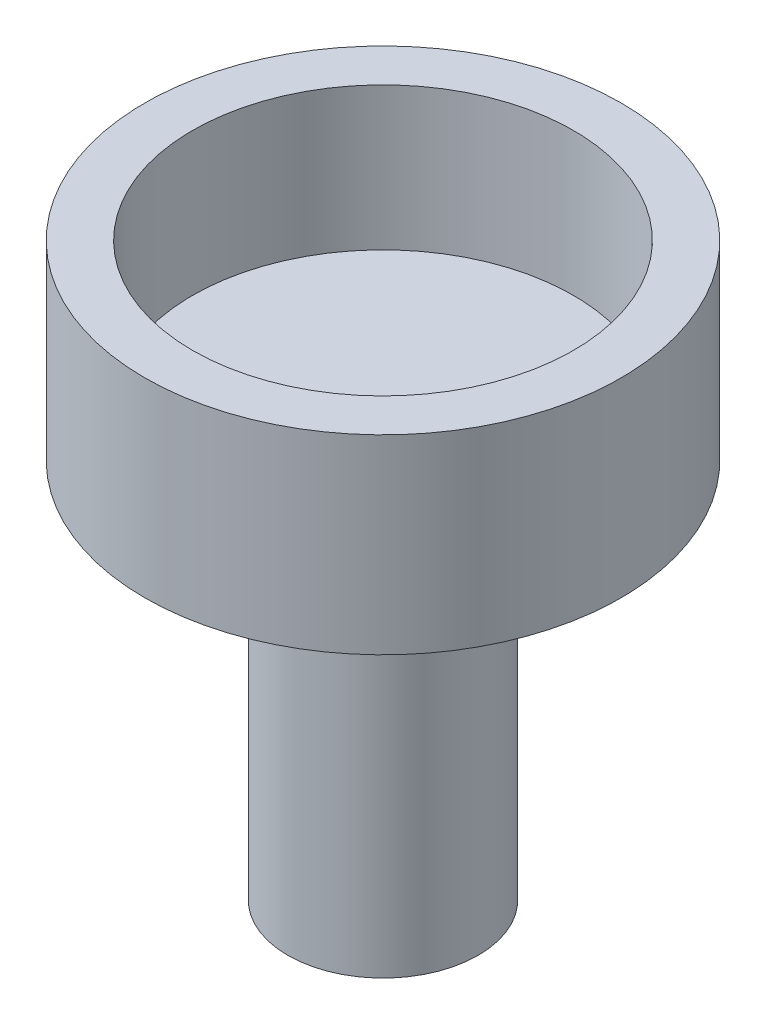
ISO-10303-21;
HEADER;
FILE_DESCRIPTION(('STEP AP214'),'2;1');
FILE_NAME('part.step','',(''),(''),'','','');
FILE_SCHEMA(('AUTOMOTIVE_DESIGN { 1 0 10303 214 1 1 1 1 }'));
ENDSEC;
DATA;
#1=APPLICATION_CONTEXT('core data for automotive mechanical design processes');
#2=APPLICATION_PROTOCOL_DEFINITION('international standard','automotive_design',2000,#1);
#3=PRODUCT_CONTEXT('',#1,'mechanical');
#4=PRODUCT('Part','Part','',(#3));
#5=PRODUCT_RELATED_PRODUCT_CATEGORY('part','',(#4));
#6=PRODUCT_DEFINITION_FORMATION('','',#4);
#7=PRODUCT_DEFINITION_CONTEXT('part definition',#1,'design');
#8=PRODUCT_DEFINITION('design','',#6,#7);
#9=PRODUCT_DEFINITION_SHAPE('','',#8);
#10=(LENGTH_UNIT() NAMED_UNIT(*) SI_UNIT(.MILLI.,.METRE.));
#11=(NAMED_UNIT(*) PLANE_ANGLE_UNIT() SI_UNIT($,.RADIAN.));
#12=(NAMED_UNIT(*) SI_UNIT($,.STERADIAN.) SOLID_ANGLE_UNIT());
#13=UNCERTAINTY_MEASURE_WITH_UNIT(LENGTH_MEASURE(1.E-05),#10,'distance_accuracy_value','');
#14=(GEOMETRIC_REPRESENTATION_CONTEXT(3) GLOBAL_UNCERTAINTY_ASSIGNED_CONTEXT((#13)) GLOBAL_UNIT_ASSIGNED_CONTEXT((#10,
#11,#12)) REPRESENTATION_CONTEXT('',''));
#15=CARTESIAN_POINT('',(0.,0.,0.));
#16=DIRECTION('',(0.,0.,1.));
#17=DIRECTION('',(1.,0.,0.));
#18=AXIS2_PLACEMENT_3D('',#15,#16,#17);
#19=CARTESIAN_POINT('',(0.,-4.,0.));
#20=DIRECTION('',(0.,1.,0.));
#21=DIRECTION('',(0.,0.,1.));
#22=AXIS2_PLACEMENT_3D('',#19,#20,#21);
#23=CYLINDRICAL_SURFACE('',#22,1.);
#24=CARTESIAN_POINT('',(0.,-4.,0.));
#25=DIRECTION('',(0.,1.,0.));
#26=DIRECTION('',(0.,0.,1.));
#27=AXIS2_PLACEMENT_3D('',#24,#25,#26);
#28=CIRCLE('',#27,1.);
#29=CARTESIAN_POINT('',(0.,-4.,1.));
#30=VERTEX_POINT('',#29);
#31=EDGE_CURVE('E39',#30,#30,#28,.T.);
#32=ORIENTED_EDGE('',*,*,#31,.T.);
#33=EDGE_LOOP('',(#32));
#34=FACE_BOUND('',#33,.T.);
#35=CARTESIAN_POINT('',(0.,0.,0.));
#36=DIRECTION('',(0.,1.,0.));
#37=DIRECTION('',(0.,0.,1.));
#38=AXIS2_PLACEMENT_3D('',#35,#36,#37);
#39=CIRCLE('',#38,1.);
#40=CARTESIAN_POINT('',(0.,0.,1.));
#41=VERTEX_POINT('',#40);
#42=EDGE_CURVE('E43',#41,#41,#39,.T.);
#43=ORIENTED_EDGE('',*,*,#42,.F.);
#44=EDGE_LOOP('',(#43));
#45=FACE_BOUND('',#44,.T.);
#46=ADVANCED_FACE('F33',(#34,#45),#23,.T.);
#47=CARTESIAN_POINT('',(0.,-4.,0.));
#48=DIRECTION('',(0.,1.,0.));
#49=DIRECTION('',(0.,0.,1.));
#50=AXIS2_PLACEMENT_3D('',#47,#48,#49);
#51=PLANE('',#50);
#52=ORIENTED_EDGE('',*,*,#31,.F.);
#53=EDGE_LOOP('',(#52));
#54=FACE_BOUND('',#53,.T.);
#55=ADVANCED_FACE('F64',(#54),#51,.F.);
#56=CARTESIAN_POINT('',(0.,0.5,0.));
#57=DIRECTION('',(0.,-1.,0.));
#58=DIRECTION('',(0.,0.,-1.));
#59=AXIS2_PLACEMENT_3D('',#56,#57,#58);
#60=CYLINDRICAL_SURFACE('',#59,2.5);
#61=CARTESIAN_POINT('',(0.,0.,0.));
#62=DIRECTION('',(0.,1.,0.));
#63=DIRECTION('',(0.,0.,1.));
#64=AXIS2_PLACEMENT_3D('',#61,#62,#63);
#65=CIRCLE('',#64,2.5);
#66=CARTESIAN_POINT('',(0.,0.,2.5));
#67=VERTEX_POINT('',#66);
#68=EDGE_CURVE('E48',#67,#67,#65,.T.);
#69=ORIENTED_EDGE('',*,*,#68,.T.);
#70=EDGE_LOOP('',(#69));
#71=FACE_BOUND('',#70,.T.);
#72=CARTESIAN_POINT('',(0.,2.,0.));
#73=DIRECTION('',(0.,1.,0.));
#74=DIRECTION('',(0.,0.,1.));
#75=AXIS2_PLACEMENT_3D('',#72,#73,#74);
#76=CIRCLE('',#75,2.5);
#77=CARTESIAN_POINT('',(0.,2.,2.5));
#78=VERTEX_POINT('',#77);
#79=EDGE_CURVE('E52',#78,#78,#76,.T.);
#80=ORIENTED_EDGE('',*,*,#79,.F.);
#81=EDGE_LOOP('',(#80));
#82=FACE_BOUND('',#81,.T.);
#83=ADVANCED_FACE('F61',(#71,#82),#60,.T.);
#84=CARTESIAN_POINT('',(0.,0.,0.));
#85=DIRECTION('',(0.,1.,0.));
#86=DIRECTION('',(0.,0.,1.));
#87=AXIS2_PLACEMENT_3D('',#84,#85,#86);
#88=PLANE('',#87);
#89=ORIENTED_EDGE('',*,*,#42,.T.);
#90=EDGE_LOOP('',(#89));
#91=FACE_BOUND('',#90,.T.);
#92=ORIENTED_EDGE('',*,*,#68,.F.);
#93=EDGE_LOOP('',(#92));
#94=FACE_BOUND('',#93,.T.);
#95=ADVANCED_FACE('F63',(#91,#94),#88,.F.);
#96=CARTESIAN_POINT('',(0.,11.0710678118655,0.));
#97=DIRECTION('',(0.,-1.,0.));
#98=DIRECTION('',(0.,0.,-1.));
#99=AXIS2_PLACEMENT_3D('',#96,#97,#98);
#100=CYLINDRICAL_SURFACE('',#99,2.);
#101=CARTESIAN_POINT('',(0.,0.5,0.));
#102=DIRECTION('',(0.,1.,0.));
#103=DIRECTION('',(0.,0.,1.));
#104=AXIS2_PLACEMENT_3D('',#101,#102,#103);
#105=CIRCLE('',#104,2.);
#106=CARTESIAN_POINT('',(0.,0.5,2.));
#107=VERTEX_POINT('',#106);
#108=EDGE_CURVE('E11',#107,#107,#105,.F.);
#109=ORIENTED_EDGE('',*,*,#108,.T.);
#110=EDGE_LOOP('',(#109));
#111=FACE_BOUND('',#110,.T.);
#112=CARTESIAN_POINT('',(0.,2.,0.));
#113=DIRECTION('',(0.,1.,0.));
#114=DIRECTION('',(0.,0.,1.));
#115=AXIS2_PLACEMENT_3D('',#112,#113,#114);
#116=CIRCLE('',#115,2.);
#117=CARTESIAN_POINT('',(0.,2.,2.));
#118=VERTEX_POINT('',#117);
#119=EDGE_CURVE('E53',#118,#118,#116,.T.);
#120=ORIENTED_EDGE('',*,*,#119,.T.);
#121=EDGE_LOOP('',(#120));
#122=FACE_BOUND('',#121,.T.);
#123=ADVANCED_FACE('F71',(#111,#122),#100,.F.);
#124=CARTESIAN_POINT('',(0.,2.,0.));
#125=DIRECTION('',(0.,1.,0.));
#126=DIRECTION('',(0.,0.,1.));
#127=AXIS2_PLACEMENT_3D('',#124,#125,#126);
#128=PLANE('',#127);
#129=ORIENTED_EDGE('',*,*,#119,.F.);
#130=EDGE_LOOP('',(#129));
#131=FACE_BOUND('',#130,.T.);
#132=ORIENTED_EDGE('',*,*,#79,.T.);
#133=EDGE_LOOP('',(#132));
#134=FACE_BOUND('',#133,.T.);
#135=ADVANCED_FACE('F59',(#131,#134),#128,.T.);
#136=CARTESIAN_POINT('',(0.,0.5,0.));
#137=DIRECTION('',(0.,1.,0.));
#138=DIRECTION('',(0.,0.,1.));
#139=AXIS2_PLACEMENT_3D('',#136,#137,#138);
#140=PLANE('',#139);
#141=ORIENTED_EDGE('',*,*,#108,.F.);
#142=EDGE_LOOP('',(#141));
#143=FACE_BOUND('',#142,.T.);
#144=ADVANCED_FACE('F115',(#143),#140,.T.);
#145=CLOSED_SHELL('',(#46,#55,#83,#95,#123,#135,#144));
#146=MANIFOLD_SOLID_BREP('B2',#145);
#147=ADVANCED_BREP_SHAPE_REPRESENTATION('',(#18,#146),#14);
#148=SHAPE_DEFINITION_REPRESENTATION(#9,#147);
ENDSEC;
END-ISO-10303-21;
